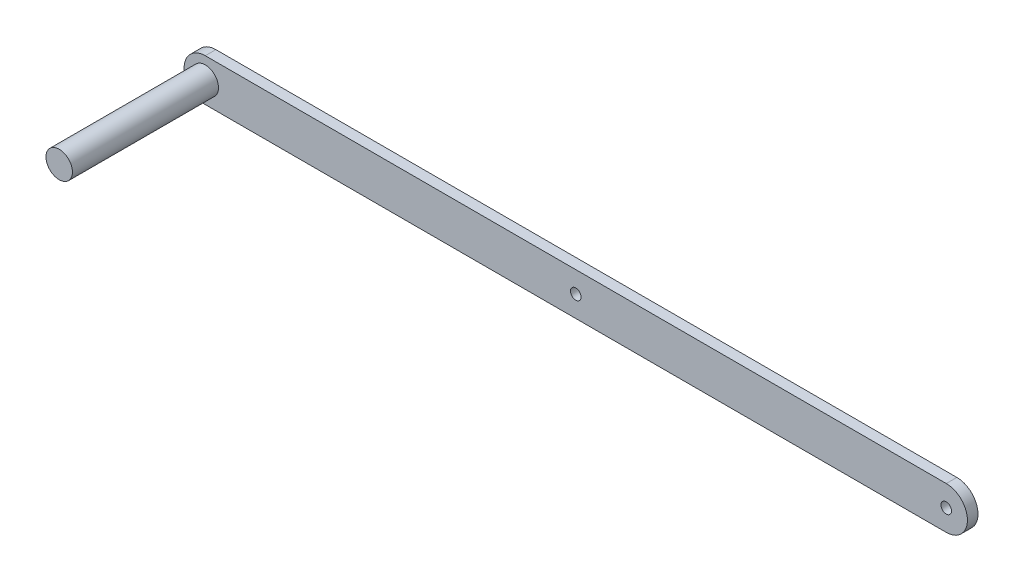
ISO-10303-21;
HEADER;
FILE_DESCRIPTION(('STEP AP214'),'2;1');
FILE_NAME('part.step','',(''),(''),'','','');
FILE_SCHEMA(('AUTOMOTIVE_DESIGN { 1 0 10303 214 1 1 1 1 }'));
ENDSEC;
DATA;
#1=APPLICATION_CONTEXT('core data for automotive mechanical design processes');
#2=APPLICATION_PROTOCOL_DEFINITION('international standard','automotive_design',2000,#1);
#3=PRODUCT_CONTEXT('',#1,'mechanical');
#4=PRODUCT('Part','Part','',(#3));
#5=PRODUCT_RELATED_PRODUCT_CATEGORY('part','',(#4));
#6=PRODUCT_DEFINITION_FORMATION('','',#4);
#7=PRODUCT_DEFINITION_CONTEXT('part definition',#1,'design');
#8=PRODUCT_DEFINITION('design','',#6,#7);
#9=PRODUCT_DEFINITION_SHAPE('','',#8);
#10=(LENGTH_UNIT() NAMED_UNIT(*) SI_UNIT(.MILLI.,.METRE.));
#11=(NAMED_UNIT(*) PLANE_ANGLE_UNIT() SI_UNIT($,.RADIAN.));
#12=(NAMED_UNIT(*) SI_UNIT($,.STERADIAN.) SOLID_ANGLE_UNIT());
#13=UNCERTAINTY_MEASURE_WITH_UNIT(LENGTH_MEASURE(1.E-05),#10,'distance_accuracy_value','');
#14=(GEOMETRIC_REPRESENTATION_CONTEXT(3) GLOBAL_UNCERTAINTY_ASSIGNED_CONTEXT((#13)) GLOBAL_UNIT_ASSIGNED_CONTEXT((#10,
#11,#12)) REPRESENTATION_CONTEXT('',''));
#15=CARTESIAN_POINT('',(0.,0.,0.));
#16=DIRECTION('',(0.,0.,1.));
#17=DIRECTION('',(1.,0.,0.));
#18=AXIS2_PLACEMENT_3D('',#15,#16,#17);
#19=CARTESIAN_POINT('',(-350.,0.,5.));
#20=DIRECTION('',(0.,0.,-1.));
#21=DIRECTION('',(-1.,0.,0.));
#22=AXIS2_PLACEMENT_3D('',#19,#20,#21);
#23=CYLINDRICAL_SURFACE('',#22,12.5);
#24=CARTESIAN_POINT('',(-350.,0.,-5.));
#25=DIRECTION('',(0.,0.,1.));
#26=DIRECTION('',(1.,0.,0.));
#27=AXIS2_PLACEMENT_3D('',#24,#25,#26);
#28=CIRCLE('',#27,12.5);
#29=CARTESIAN_POINT('',(-337.5,0.,-5.));
#30=VERTEX_POINT('',#29);
#31=EDGE_CURVE('E123',#30,#30,#28,.T.);
#32=ORIENTED_EDGE('',*,*,#31,.F.);
#33=EDGE_LOOP('',(#32));
#34=FACE_BOUND('',#33,.T.);
#35=CARTESIAN_POINT('',(-350.,0.,0.));
#36=DIRECTION('',(0.,0.,1.));
#37=DIRECTION('',(1.,0.,0.));
#38=AXIS2_PLACEMENT_3D('',#35,#36,#37);
#39=CIRCLE('',#38,12.5);
#40=CARTESIAN_POINT('',(-337.5,0.,0.));
#41=VERTEX_POINT('',#40);
#42=EDGE_CURVE('E132',#41,#41,#39,.T.);
#43=ORIENTED_EDGE('',*,*,#42,.T.);
#44=EDGE_LOOP('',(#43));
#45=FACE_BOUND('',#44,.T.);
#46=ADVANCED_FACE('F35',(#34,#45),#23,.F.);
#47=CARTESIAN_POINT('',(-350.,0.,5.));
#48=DIRECTION('',(0.,0.,1.));
#49=DIRECTION('',(1.,0.,0.));
#50=AXIS2_PLACEMENT_3D('',#47,#48,#49);
#51=PLANE('',#50);
#52=CARTESIAN_POINT('',(0.,0.,5.));
#53=DIRECTION('',(0.,0.,1.));
#54=DIRECTION('',(1.,0.,0.));
#55=AXIS2_PLACEMENT_3D('',#52,#53,#54);
#56=CIRCLE('',#55,5.);
#57=CARTESIAN_POINT('',(5.,0.,5.));
#58=VERTEX_POINT('',#57);
#59=EDGE_CURVE('E128',#58,#58,#56,.T.);
#60=ORIENTED_EDGE('',*,*,#59,.F.);
#61=EDGE_LOOP('',(#60));
#62=FACE_BOUND('',#61,.T.);
#63=CARTESIAN_POINT('',(350.,1.28587913910472E-13,5.));
#64=DIRECTION('',(0.,0.,1.));
#65=DIRECTION('',(1.,0.,0.));
#66=AXIS2_PLACEMENT_3D('',#63,#64,#65);
#67=CIRCLE('',#66,4.99999999999999);
#68=CARTESIAN_POINT('',(355.,1.28587913910472E-13,5.));
#69=VERTEX_POINT('',#68);
#70=EDGE_CURVE('E105',#69,#69,#67,.T.);
#71=ORIENTED_EDGE('',*,*,#70,.F.);
#72=EDGE_LOOP('',(#71));
#73=FACE_BOUND('',#72,.T.);
#74=CARTESIAN_POINT('',(-350.,0.,5.));
#75=DIRECTION('',(0.,0.,1.));
#76=DIRECTION('',(1.,0.,0.));
#77=AXIS2_PLACEMENT_3D('',#74,#75,#76);
#78=CIRCLE('',#77,20.0000000000001);
#79=CARTESIAN_POINT('',(-350.,20.0000000000001,5.));
#80=VERTEX_POINT('',#79);
#81=CARTESIAN_POINT('',(-350.,-20.0000000000001,5.));
#82=VERTEX_POINT('',#81);
#83=EDGE_CURVE('E89',#80,#82,#78,.T.);
#84=ORIENTED_EDGE('',*,*,#83,.T.);
#85=DIRECTION('',(1.,0.,0.));
#86=VECTOR('',#85,1.);
#87=CARTESIAN_POINT('',(-350.,-20.0000000000001,5.));
#88=LINE('',#87,#86);
#89=CARTESIAN_POINT('',(350.,-20.,5.));
#90=VERTEX_POINT('',#89);
#91=EDGE_CURVE('E83',#82,#90,#88,.T.);
#92=ORIENTED_EDGE('',*,*,#91,.T.);
#93=CARTESIAN_POINT('',(350.,1.28587913910472E-13,5.));
#94=DIRECTION('',(0.,0.,1.));
#95=DIRECTION('',(1.,0.,0.));
#96=AXIS2_PLACEMENT_3D('',#93,#94,#95);
#97=CIRCLE('',#96,20.0000000000001);
#98=CARTESIAN_POINT('',(350.,20.0000000000003,5.));
#99=VERTEX_POINT('',#98);
#100=EDGE_CURVE('E87',#90,#99,#97,.T.);
#101=ORIENTED_EDGE('',*,*,#100,.T.);
#102=DIRECTION('',(-1.,0.,0.));
#103=VECTOR('',#102,1.);
#104=CARTESIAN_POINT('',(-350.,20.0000000000001,5.));
#105=LINE('',#104,#103);
#106=EDGE_CURVE('E53',#99,#80,#105,.T.);
#107=ORIENTED_EDGE('',*,*,#106,.T.);
#108=EDGE_LOOP('',(#84,#92,#101,#107));
#109=FACE_BOUND('',#108,.T.);
#110=CARTESIAN_POINT('',(-350.,0.,5.));
#111=DIRECTION('',(0.,0.,1.));
#112=DIRECTION('',(1.,0.,0.));
#113=AXIS2_PLACEMENT_3D('',#110,#111,#112);
#114=CIRCLE('',#113,12.5);
#115=CARTESIAN_POINT('',(-337.5,0.,5.));
#116=VERTEX_POINT('',#115);
#117=EDGE_CURVE('E120',#116,#116,#114,.T.);
#118=ORIENTED_EDGE('',*,*,#117,.F.);
#119=EDGE_LOOP('',(#118));
#120=FACE_BOUND('',#119,.T.);
#121=ADVANCED_FACE('F84',(#62,#73,#109,#120),#51,.T.);
#122=CARTESIAN_POINT('',(-350.,0.,-5.));
#123=DIRECTION('',(0.,0.,1.));
#124=DIRECTION('',(1.,0.,0.));
#125=AXIS2_PLACEMENT_3D('',#122,#123,#124);
#126=PLANE('',#125);
#127=CARTESIAN_POINT('',(0.,0.,-5.));
#128=DIRECTION('',(0.,0.,1.));
#129=DIRECTION('',(1.,0.,0.));
#130=AXIS2_PLACEMENT_3D('',#127,#128,#129);
#131=CIRCLE('',#130,5.);
#132=CARTESIAN_POINT('',(5.,0.,-5.));
#133=VERTEX_POINT('',#132);
#134=EDGE_CURVE('E39',#133,#133,#131,.T.);
#135=ORIENTED_EDGE('',*,*,#134,.T.);
#136=EDGE_LOOP('',(#135));
#137=FACE_BOUND('',#136,.T.);
#138=CARTESIAN_POINT('',(-350.,0.,-5.));
#139=DIRECTION('',(0.,0.,1.));
#140=DIRECTION('',(1.,0.,0.));
#141=AXIS2_PLACEMENT_3D('',#138,#139,#140);
#142=CIRCLE('',#141,20.0000000000001);
#143=CARTESIAN_POINT('',(-350.,20.0000000000001,-5.));
#144=VERTEX_POINT('',#143);
#145=CARTESIAN_POINT('',(-350.,-20.0000000000001,-5.));
#146=VERTEX_POINT('',#145);
#147=EDGE_CURVE('E102',#144,#146,#142,.T.);
#148=ORIENTED_EDGE('',*,*,#147,.F.);
#149=DIRECTION('',(-1.,0.,0.));
#150=VECTOR('',#149,1.);
#151=CARTESIAN_POINT('',(-350.,20.0000000000001,-5.));
#152=LINE('',#151,#150);
#153=CARTESIAN_POINT('',(350.,20.0000000000003,-5.));
#154=VERTEX_POINT('',#153);
#155=EDGE_CURVE('E76',#154,#144,#152,.T.);
#156=ORIENTED_EDGE('',*,*,#155,.F.);
#157=CARTESIAN_POINT('',(350.,1.28587913910472E-13,-5.));
#158=DIRECTION('',(0.,0.,1.));
#159=DIRECTION('',(1.,0.,0.));
#160=AXIS2_PLACEMENT_3D('',#157,#158,#159);
#161=CIRCLE('',#160,20.0000000000001);
#162=CARTESIAN_POINT('',(350.,-20.,-5.));
#163=VERTEX_POINT('',#162);
#164=EDGE_CURVE('E70',#163,#154,#161,.T.);
#165=ORIENTED_EDGE('',*,*,#164,.F.);
#166=DIRECTION('',(1.,0.,0.));
#167=VECTOR('',#166,1.);
#168=CARTESIAN_POINT('',(-350.,-20.0000000000001,-5.));
#169=LINE('',#168,#167);
#170=EDGE_CURVE('E93',#146,#163,#169,.T.);
#171=ORIENTED_EDGE('',*,*,#170,.F.);
#172=EDGE_LOOP('',(#148,#156,#165,#171));
#173=FACE_BOUND('',#172,.T.);
#174=CARTESIAN_POINT('',(350.,1.28587913910472E-13,-5.));
#175=DIRECTION('',(0.,0.,1.));
#176=DIRECTION('',(1.,0.,0.));
#177=AXIS2_PLACEMENT_3D('',#174,#175,#176);
#178=CIRCLE('',#177,4.99999999999999);
#179=CARTESIAN_POINT('',(355.,1.28587913910472E-13,-5.));
#180=VERTEX_POINT('',#179);
#181=EDGE_CURVE('E117',#180,#180,#178,.T.);
#182=ORIENTED_EDGE('',*,*,#181,.T.);
#183=EDGE_LOOP('',(#182));
#184=FACE_BOUND('',#183,.T.);
#185=ORIENTED_EDGE('',*,*,#31,.T.);
#186=EDGE_LOOP('',(#185));
#187=FACE_BOUND('',#186,.T.);
#188=ADVANCED_FACE('F113',(#137,#173,#184,#187),#126,.F.);
#189=CARTESIAN_POINT('',(-350.,0.,5.));
#190=DIRECTION('',(0.,0.,-1.));
#191=DIRECTION('',(-1.,0.,0.));
#192=AXIS2_PLACEMENT_3D('',#189,#190,#191);
#193=CYLINDRICAL_SURFACE('',#192,20.0000000000001);
#194=ORIENTED_EDGE('',*,*,#147,.T.);
#195=DIRECTION('',(0.,0.,-1.));
#196=VECTOR('',#195,1.);
#197=CARTESIAN_POINT('',(-350.,-20.0000000000001,5.));
#198=LINE('',#197,#196);
#199=EDGE_CURVE('E11',#82,#146,#198,.T.);
#200=ORIENTED_EDGE('',*,*,#199,.F.);
#201=ORIENTED_EDGE('',*,*,#83,.F.);
#202=DIRECTION('',(0.,0.,-1.));
#203=VECTOR('',#202,1.);
#204=CARTESIAN_POINT('',(-350.,20.0000000000001,5.));
#205=LINE('',#204,#203);
#206=EDGE_CURVE('E98',#80,#144,#205,.T.);
#207=ORIENTED_EDGE('',*,*,#206,.T.);
#208=EDGE_LOOP('',(#194,#200,#201,#207));
#209=FACE_BOUND('',#208,.T.);
#210=ADVANCED_FACE('F37',(#209),#193,.T.);
#211=CARTESIAN_POINT('',(-350.,-20.0000000000001,5.));
#212=DIRECTION('',(0.,1.,0.));
#213=DIRECTION('',(-1.,0.,0.));
#214=AXIS2_PLACEMENT_3D('',#211,#212,#213);
#215=PLANE('',#214);
#216=ORIENTED_EDGE('',*,*,#170,.T.);
#217=DIRECTION('',(0.,0.,-1.));
#218=VECTOR('',#217,1.);
#219=CARTESIAN_POINT('',(350.,-20.,5.));
#220=LINE('',#219,#218);
#221=EDGE_CURVE('E45',#90,#163,#220,.T.);
#222=ORIENTED_EDGE('',*,*,#221,.F.);
#223=ORIENTED_EDGE('',*,*,#91,.F.);
#224=ORIENTED_EDGE('',*,*,#199,.T.);
#225=EDGE_LOOP('',(#216,#222,#223,#224));
#226=FACE_BOUND('',#225,.T.);
#227=ADVANCED_FACE('F92',(#226),#215,.F.);
#228=CARTESIAN_POINT('',(350.,1.28587913910472E-13,5.));
#229=DIRECTION('',(0.,0.,-1.));
#230=DIRECTION('',(-1.,0.,0.));
#231=AXIS2_PLACEMENT_3D('',#228,#229,#230);
#232=CYLINDRICAL_SURFACE('',#231,20.0000000000001);
#233=ORIENTED_EDGE('',*,*,#164,.T.);
#234=DIRECTION('',(0.,0.,-1.));
#235=VECTOR('',#234,1.);
#236=CARTESIAN_POINT('',(350.,20.0000000000003,5.));
#237=LINE('',#236,#235);
#238=EDGE_CURVE('E94',#99,#154,#237,.T.);
#239=ORIENTED_EDGE('',*,*,#238,.F.);
#240=ORIENTED_EDGE('',*,*,#100,.F.);
#241=ORIENTED_EDGE('',*,*,#221,.T.);
#242=EDGE_LOOP('',(#233,#239,#240,#241));
#243=FACE_BOUND('',#242,.T.);
#244=ADVANCED_FACE('F96',(#243),#232,.T.);
#245=CARTESIAN_POINT('',(-350.,20.0000000000001,5.));
#246=DIRECTION('',(0.,-1.,0.));
#247=DIRECTION('',(1.,0.,0.));
#248=AXIS2_PLACEMENT_3D('',#245,#246,#247);
#249=PLANE('',#248);
#250=ORIENTED_EDGE('',*,*,#155,.T.);
#251=ORIENTED_EDGE('',*,*,#206,.F.);
#252=ORIENTED_EDGE('',*,*,#106,.F.);
#253=ORIENTED_EDGE('',*,*,#238,.T.);
#254=EDGE_LOOP('',(#250,#251,#252,#253));
#255=FACE_BOUND('',#254,.T.);
#256=ADVANCED_FACE('F110',(#255),#249,.F.);
#257=CARTESIAN_POINT('',(350.,1.28587913910472E-13,5.));
#258=DIRECTION('',(0.,0.,-1.));
#259=DIRECTION('',(-1.,0.,0.));
#260=AXIS2_PLACEMENT_3D('',#257,#258,#259);
#261=CYLINDRICAL_SURFACE('',#260,4.99999999999999);
#262=ORIENTED_EDGE('',*,*,#70,.T.);
#263=EDGE_LOOP('',(#262));
#264=FACE_BOUND('',#263,.T.);
#265=ORIENTED_EDGE('',*,*,#181,.F.);
#266=EDGE_LOOP('',(#265));
#267=FACE_BOUND('',#266,.T.);
#268=ADVANCED_FACE('F165',(#264,#267),#261,.F.);
#269=CARTESIAN_POINT('',(0.,0.,-10.));
#270=DIRECTION('',(0.,0.,1.));
#271=DIRECTION('',(1.,0.,0.));
#272=AXIS2_PLACEMENT_3D('',#269,#270,#271);
#273=CYLINDRICAL_SURFACE('',#272,5.);
#274=ORIENTED_EDGE('',*,*,#59,.T.);
#275=EDGE_LOOP('',(#274));
#276=FACE_BOUND('',#275,.T.);
#277=ORIENTED_EDGE('',*,*,#134,.F.);
#278=EDGE_LOOP('',(#277));
#279=FACE_BOUND('',#278,.T.);
#280=ADVANCED_FACE('F150',(#276,#279),#273,.F.);
#281=CARTESIAN_POINT('',(0.,0.,0.));
#282=DIRECTION('',(0.,0.,1.));
#283=DIRECTION('',(1.,0.,0.));
#284=AXIS2_PLACEMENT_3D('',#281,#282,#283);
#285=PLANE('',#284);
#286=ORIENTED_EDGE('',*,*,#42,.F.);
#287=EDGE_LOOP('',(#286));
#288=FACE_BOUND('',#287,.T.);
#289=ADVANCED_FACE('F142',(#288),#285,.F.);
#290=CARTESIAN_POINT('',(-350.,0.,143.));
#291=DIRECTION('',(0.,0.,-1.));
#292=DIRECTION('',(-1.,0.,0.));
#293=AXIS2_PLACEMENT_3D('',#290,#291,#292);
#294=CYLINDRICAL_SURFACE('',#293,12.5);
#295=ORIENTED_EDGE('',*,*,#117,.T.);
#296=EDGE_LOOP('',(#295));
#297=FACE_BOUND('',#296,.T.);
#298=CARTESIAN_POINT('',(-350.,0.,143.));
#299=DIRECTION('',(0.,0.,1.));
#300=DIRECTION('',(1.,0.,0.));
#301=AXIS2_PLACEMENT_3D('',#298,#299,#300);
#302=CIRCLE('',#301,12.5);
#303=CARTESIAN_POINT('',(-337.5,0.,143.));
#304=VERTEX_POINT('',#303);
#305=EDGE_CURVE('E131',#304,#304,#302,.T.);
#306=ORIENTED_EDGE('',*,*,#305,.F.);
#307=EDGE_LOOP('',(#306));
#308=FACE_BOUND('',#307,.T.);
#309=ADVANCED_FACE('F140',(#297,#308),#294,.T.);
#310=CARTESIAN_POINT('',(0.,0.,143.));
#311=DIRECTION('',(0.,0.,1.));
#312=DIRECTION('',(1.,0.,0.));
#313=AXIS2_PLACEMENT_3D('',#310,#311,#312);
#314=PLANE('',#313);
#315=ORIENTED_EDGE('',*,*,#305,.T.);
#316=EDGE_LOOP('',(#315));
#317=FACE_BOUND('',#316,.T.);
#318=ADVANCED_FACE('F138',(#317),#314,.T.);
#319=CLOSED_SHELL('',(#46,#121,#188,#210,#227,#244,#256,#268,#280,#289,#309,#318));
#320=MANIFOLD_SOLID_BREP('B2',#319);
#321=ADVANCED_BREP_SHAPE_REPRESENTATION('',(#18,#320),#14);
#322=SHAPE_DEFINITION_REPRESENTATION(#9,#321);
ENDSEC;
END-ISO-10303-21;
